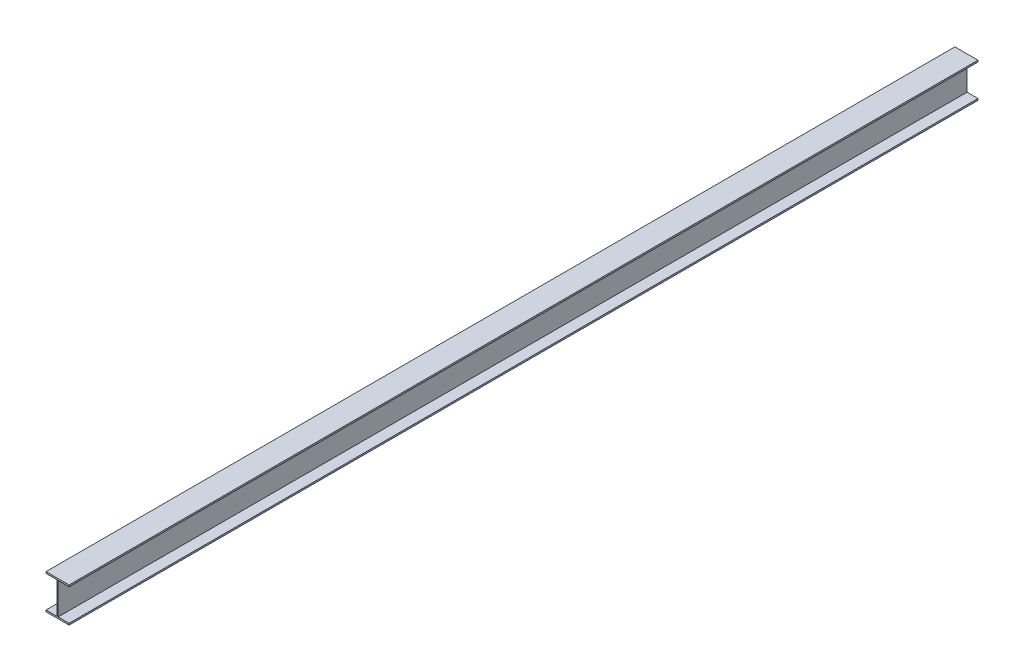
ISO-10303-21;
HEADER;
FILE_DESCRIPTION(('STEP AP214'),'2;1');
FILE_NAME('part.step','',(''),(''),'','','');
FILE_SCHEMA(('AUTOMOTIVE_DESIGN { 1 0 10303 214 1 1 1 1 }'));
ENDSEC;
DATA;
#1=APPLICATION_CONTEXT('core data for automotive mechanical design processes');
#2=APPLICATION_PROTOCOL_DEFINITION('international standard','automotive_design',2000,#1);
#3=PRODUCT_CONTEXT('',#1,'mechanical');
#4=PRODUCT('Part','Part','',(#3));
#5=PRODUCT_RELATED_PRODUCT_CATEGORY('part','',(#4));
#6=PRODUCT_DEFINITION_FORMATION('','',#4);
#7=PRODUCT_DEFINITION_CONTEXT('part definition',#1,'design');
#8=PRODUCT_DEFINITION('design','',#6,#7);
#9=PRODUCT_DEFINITION_SHAPE('','',#8);
#10=(LENGTH_UNIT() NAMED_UNIT(*) SI_UNIT(.MILLI.,.METRE.));
#11=(NAMED_UNIT(*) PLANE_ANGLE_UNIT() SI_UNIT($,.RADIAN.));
#12=(NAMED_UNIT(*) SI_UNIT($,.STERADIAN.) SOLID_ANGLE_UNIT());
#13=UNCERTAINTY_MEASURE_WITH_UNIT(LENGTH_MEASURE(1.E-05),#10,'distance_accuracy_value','');
#14=(GEOMETRIC_REPRESENTATION_CONTEXT(3) GLOBAL_UNCERTAINTY_ASSIGNED_CONTEXT((#13)) GLOBAL_UNIT_ASSIGNED_CONTEXT((#10,
#11,#12)) REPRESENTATION_CONTEXT('',''));
#15=CARTESIAN_POINT('',(0.,0.,0.));
#16=DIRECTION('',(0.,0.,1.));
#17=DIRECTION('',(1.,0.,0.));
#18=AXIS2_PLACEMENT_3D('',#15,#16,#17);
#19=CARTESIAN_POINT('',(101.6,-153.162240532958,4000.));
#20=DIRECTION('',(0.,1.,0.));
#21=DIRECTION('',(0.,0.,1.));
#22=AXIS2_PLACEMENT_3D('',#19,#20,#21);
#23=PLANE('',#22);
#24=DIRECTION('',(-1.,0.,0.));
#25=VECTOR('',#24,1.);
#26=CARTESIAN_POINT('',(101.6,-153.162240532958,2152.4));
#27=LINE('',#26,#25);
#28=CARTESIAN_POINT('',(101.6,-153.162240532958,2152.4));
#29=VERTEX_POINT('',#28);
#30=CARTESIAN_POINT('',(0.,-153.162240532958,2152.4));
#31=VERTEX_POINT('',#30);
#32=EDGE_CURVE('E11',#29,#31,#27,.T.);
#33=ORIENTED_EDGE('',*,*,#32,.F.);
#34=DIRECTION('',(0.,0.,-1.));
#35=VECTOR('',#34,1.);
#36=CARTESIAN_POINT('',(101.6,-153.162240532958,4000.));
#37=LINE('',#36,#35);
#38=CARTESIAN_POINT('',(101.6,-153.162240532958,4000.));
#39=VERTEX_POINT('',#38);
#40=EDGE_CURVE('E177',#39,#29,#37,.T.);
#41=ORIENTED_EDGE('',*,*,#40,.F.);
#42=DIRECTION('',(1.,0.,0.));
#43=VECTOR('',#42,1.);
#44=CARTESIAN_POINT('',(101.6,-153.162240532958,4000.));
#45=LINE('',#44,#43);
#46=CARTESIAN_POINT('',(0.,-153.162240532958,4000.));
#47=VERTEX_POINT('',#46);
#48=EDGE_CURVE('E234',#47,#39,#45,.T.);
#49=ORIENTED_EDGE('',*,*,#48,.F.);
#50=DIRECTION('',(0.,0.,-1.));
#51=VECTOR('',#50,1.);
#52=CARTESIAN_POINT('',(0.,-153.162240532958,4000.));
#53=LINE('',#52,#51);
#54=EDGE_CURVE('E172',#47,#31,#53,.T.);
#55=ORIENTED_EDGE('',*,*,#54,.T.);
#56=EDGE_LOOP('',(#33,#41,#49,#55));
#57=FACE_BOUND('',#56,.T.);
#58=ADVANCED_FACE('F35',(#57),#23,.F.);
#59=DIRECTION('',(1.,0.,0.));
#60=VECTOR('',#59,1.);
#61=CARTESIAN_POINT('',(101.6,-153.162240532958,1847.6));
#62=LINE('',#61,#60);
#63=CARTESIAN_POINT('',(0.,-153.162240532958,1847.6));
#64=VERTEX_POINT('',#63);
#65=CARTESIAN_POINT('',(101.6,-153.162240532958,1847.6));
#66=VERTEX_POINT('',#65);
#67=EDGE_CURVE('E44',#64,#66,#62,.T.);
#68=ORIENTED_EDGE('',*,*,#67,.F.);
#69=CARTESIAN_POINT('',(0.,-153.162240532958,0.));
#70=VERTEX_POINT('',#69);
#71=EDGE_CURVE('E176',#64,#70,#53,.T.);
#72=ORIENTED_EDGE('',*,*,#71,.T.);
#73=DIRECTION('',(1.,0.,0.));
#74=VECTOR('',#73,1.);
#75=CARTESIAN_POINT('',(101.6,-153.162240532958,0.));
#76=LINE('',#75,#74);
#77=CARTESIAN_POINT('',(101.6,-153.162240532958,0.));
#78=VERTEX_POINT('',#77);
#79=EDGE_CURVE('E210',#70,#78,#76,.T.);
#80=ORIENTED_EDGE('',*,*,#79,.T.);
#81=EDGE_CURVE('E181',#66,#78,#37,.T.);
#82=ORIENTED_EDGE('',*,*,#81,.F.);
#83=EDGE_LOOP('',(#68,#72,#80,#82));
#84=FACE_BOUND('',#83,.T.);
#85=ADVANCED_FACE('F292',(#84),#23,.F.);
#86=CARTESIAN_POINT('',(0.,-7.11224053295814,4000.));
#87=DIRECTION('',(1.,0.,0.));
#88=DIRECTION('',(0.,0.,-1.));
#89=AXIS2_PLACEMENT_3D('',#86,#87,#88);
#90=PLANE('',#89);
#91=DIRECTION('',(0.,-1.,0.));
#92=VECTOR('',#91,1.);
#93=CARTESIAN_POINT('',(0.,-7.11224053295814,0.));
#94=LINE('',#93,#92);
#95=CARTESIAN_POINT('',(0.,-0.000240532958142959,0.));
#96=VERTEX_POINT('',#95);
#97=CARTESIAN_POINT('',(0.,-7.11224053295814,0.));
#98=VERTEX_POINT('',#97);
#99=EDGE_CURVE('E161',#96,#98,#94,.T.);
#100=ORIENTED_EDGE('',*,*,#99,.T.);
#101=DIRECTION('',(0.,0.,-1.));
#102=VECTOR('',#101,1.);
#103=CARTESIAN_POINT('',(0.,-7.11224053295814,4000.));
#104=LINE('',#103,#102);
#105=CARTESIAN_POINT('',(0.,-7.11224053295814,4000.));
#106=VERTEX_POINT('',#105);
#107=EDGE_CURVE('E142',#106,#98,#104,.T.);
#108=ORIENTED_EDGE('',*,*,#107,.F.);
#109=DIRECTION('',(0.,-1.,0.));
#110=VECTOR('',#109,1.);
#111=CARTESIAN_POINT('',(0.,-7.11224053295814,4000.));
#112=LINE('',#111,#110);
#113=CARTESIAN_POINT('',(0.,-0.000240532958142959,4000.));
#114=VERTEX_POINT('',#113);
#115=EDGE_CURVE('E149',#114,#106,#112,.T.);
#116=ORIENTED_EDGE('',*,*,#115,.F.);
#117=DIRECTION('',(0.,0.,-1.));
#118=VECTOR('',#117,1.);
#119=CARTESIAN_POINT('',(0.,-0.000240532958142959,4000.));
#120=LINE('',#119,#118);
#121=EDGE_CURVE('E197',#114,#96,#120,.T.);
#122=ORIENTED_EDGE('',*,*,#121,.T.);
#123=EDGE_LOOP('',(#100,#108,#116,#122));
#124=FACE_BOUND('',#123,.T.);
#125=ADVANCED_FACE('F37',(#124),#90,.F.);
#126=CARTESIAN_POINT('',(47.5660357142857,-7.11224053295814,4000.));
#127=DIRECTION('',(0.,1.,0.));
#128=DIRECTION('',(-1.,0.,0.));
#129=AXIS2_PLACEMENT_3D('',#126,#127,#128);
#130=PLANE('',#129);
#131=DIRECTION('',(1.,0.,0.));
#132=VECTOR('',#131,1.);
#133=CARTESIAN_POINT('',(47.5660357142857,-7.11224053295814,0.));
#134=LINE('',#133,#132);
#135=CARTESIAN_POINT('',(47.5660357142857,-7.11224053295814,0.));
#136=VERTEX_POINT('',#135);
#137=EDGE_CURVE('E220',#98,#136,#134,.T.);
#138=ORIENTED_EDGE('',*,*,#137,.T.);
#139=DIRECTION('',(0.,0.,-1.));
#140=VECTOR('',#139,1.);
#141=CARTESIAN_POINT('',(47.5660357142857,-7.11224053295814,4000.));
#142=LINE('',#141,#140);
#143=CARTESIAN_POINT('',(47.5660357142857,-7.11224053295814,4000.));
#144=VERTEX_POINT('',#143);
#145=EDGE_CURVE('E145',#144,#136,#142,.T.);
#146=ORIENTED_EDGE('',*,*,#145,.F.);
#147=DIRECTION('',(1.,0.,0.));
#148=VECTOR('',#147,1.);
#149=CARTESIAN_POINT('',(47.5660357142857,-7.11224053295814,4000.));
#150=LINE('',#149,#148);
#151=EDGE_CURVE('E138',#106,#144,#150,.T.);
#152=ORIENTED_EDGE('',*,*,#151,.F.);
#153=ORIENTED_EDGE('',*,*,#107,.T.);
#154=EDGE_LOOP('',(#138,#146,#152,#153));
#155=FACE_BOUND('',#154,.T.);
#156=ADVANCED_FACE('F140',(#155),#130,.F.);
#157=CARTESIAN_POINT('',(47.5660357142857,-146.050240532958,4000.));
#158=DIRECTION('',(1.,0.,0.));
#159=DIRECTION('',(0.,0.,-1.));
#160=AXIS2_PLACEMENT_3D('',#157,#158,#159);
#161=PLANE('',#160);
#162=DIRECTION('',(0.,-1.,0.));
#163=VECTOR('',#162,1.);
#164=CARTESIAN_POINT('',(47.5660357142857,-146.050240532958,0.));
#165=LINE('',#164,#163);
#166=CARTESIAN_POINT('',(47.5660357142857,-146.050240532958,0.));
#167=VERTEX_POINT('',#166);
#168=EDGE_CURVE('E218',#136,#167,#165,.T.);
#169=ORIENTED_EDGE('',*,*,#168,.T.);
#170=DIRECTION('',(0.,0.,-1.));
#171=VECTOR('',#170,1.);
#172=CARTESIAN_POINT('',(47.5660357142857,-146.050240532958,4000.));
#173=LINE('',#172,#171);
#174=CARTESIAN_POINT('',(47.5660357142857,-146.050240532958,4000.));
#175=VERTEX_POINT('',#174);
#176=EDGE_CURVE('E164',#175,#167,#173,.T.);
#177=ORIENTED_EDGE('',*,*,#176,.F.);
#178=DIRECTION('',(0.,-1.,0.));
#179=VECTOR('',#178,1.);
#180=CARTESIAN_POINT('',(47.5660357142857,-146.050240532958,4000.));
#181=LINE('',#180,#179);
#182=EDGE_CURVE('E148',#144,#175,#181,.T.);
#183=ORIENTED_EDGE('',*,*,#182,.F.);
#184=ORIENTED_EDGE('',*,*,#145,.T.);
#185=EDGE_LOOP('',(#169,#177,#183,#184));
#186=FACE_BOUND('',#185,.T.);
#187=ADVANCED_FACE('F244',(#186),#161,.F.);
#188=CARTESIAN_POINT('',(0.,-146.050240532958,4000.));
#189=DIRECTION('',(0.,-1.,0.));
#190=DIRECTION('',(1.,0.,0.));
#191=AXIS2_PLACEMENT_3D('',#188,#189,#190);
#192=PLANE('',#191);
#193=DIRECTION('',(-1.,0.,0.));
#194=VECTOR('',#193,1.);
#195=CARTESIAN_POINT('',(0.,-146.050240532958,0.));
#196=LINE('',#195,#194);
#197=CARTESIAN_POINT('',(0.,-146.050240532958,0.));
#198=VERTEX_POINT('',#197);
#199=EDGE_CURVE('E216',#167,#198,#196,.T.);
#200=ORIENTED_EDGE('',*,*,#199,.T.);
#201=DIRECTION('',(0.,0.,-1.));
#202=VECTOR('',#201,1.);
#203=CARTESIAN_POINT('',(0.,-146.050240532958,4000.));
#204=LINE('',#203,#202);
#205=CARTESIAN_POINT('',(0.,-146.050240532958,4000.));
#206=VERTEX_POINT('',#205);
#207=EDGE_CURVE('E169',#206,#198,#204,.T.);
#208=ORIENTED_EDGE('',*,*,#207,.F.);
#209=DIRECTION('',(-1.,0.,0.));
#210=VECTOR('',#209,1.);
#211=CARTESIAN_POINT('',(0.,-146.050240532958,4000.));
#212=LINE('',#211,#210);
#213=EDGE_CURVE('E238',#175,#206,#212,.T.);
#214=ORIENTED_EDGE('',*,*,#213,.F.);
#215=ORIENTED_EDGE('',*,*,#176,.T.);
#216=EDGE_LOOP('',(#200,#208,#214,#215));
#217=FACE_BOUND('',#216,.T.);
#218=ADVANCED_FACE('F248',(#217),#192,.F.);
#219=CARTESIAN_POINT('',(0.,-153.162240532958,4000.));
#220=DIRECTION('',(1.,0.,0.));
#221=DIRECTION('',(0.,0.,-1.));
#222=AXIS2_PLACEMENT_3D('',#219,#220,#221);
#223=PLANE('',#222);
#224=DIRECTION('',(0.,-1.,0.));
#225=VECTOR('',#224,1.);
#226=CARTESIAN_POINT('',(0.,-153.162240532958,0.));
#227=LINE('',#226,#225);
#228=EDGE_CURVE('E213',#198,#70,#227,.T.);
#229=ORIENTED_EDGE('',*,*,#228,.T.);
#230=ORIENTED_EDGE('',*,*,#71,.F.);
#231=EDGE_CURVE('E175',#31,#64,#53,.T.);
#232=ORIENTED_EDGE('',*,*,#231,.F.);
#233=ORIENTED_EDGE('',*,*,#54,.F.);
#234=DIRECTION('',(0.,-1.,0.));
#235=VECTOR('',#234,1.);
#236=CARTESIAN_POINT('',(0.,-153.162240532958,4000.));
#237=LINE('',#236,#235);
#238=EDGE_CURVE('E236',#206,#47,#237,.T.);
#239=ORIENTED_EDGE('',*,*,#238,.F.);
#240=ORIENTED_EDGE('',*,*,#207,.T.);
#241=EDGE_LOOP('',(#229,#230,#232,#233,#239,#240));
#242=FACE_BOUND('',#241,.T.);
#243=ADVANCED_FACE('F253',(#242),#223,.F.);
#244=CARTESIAN_POINT('',(101.6,-153.162240532958,2000.));
#245=VERTEX_POINT('',#244);
#246=EDGE_CURVE('E180',#29,#245,#37,.T.);
#247=ORIENTED_EDGE('',*,*,#246,.F.);
#248=ORIENTED_EDGE('',*,*,#32,.T.);
#249=ORIENTED_EDGE('',*,*,#231,.T.);
#250=ORIENTED_EDGE('',*,*,#67,.T.);
#251=EDGE_CURVE('E291',#245,#66,#37,.T.);
#252=ORIENTED_EDGE('',*,*,#251,.F.);
#253=EDGE_LOOP('',(#247,#248,#249,#250,#252));
#254=FACE_BOUND('',#253,.T.);
#255=ADVANCED_FACE('F289',(#254),#23,.F.);
#256=CARTESIAN_POINT('',(101.6,-146.050240532958,4000.));
#257=DIRECTION('',(-1.,0.,0.));
#258=DIRECTION('',(0.,0.,1.));
#259=AXIS2_PLACEMENT_3D('',#256,#257,#258);
#260=PLANE('',#259);
#261=DIRECTION('',(0.,1.,0.));
#262=VECTOR('',#261,1.);
#263=CARTESIAN_POINT('',(101.6,-146.050240532958,0.));
#264=LINE('',#263,#262);
#265=CARTESIAN_POINT('',(101.6,-146.050240532958,0.));
#266=VERTEX_POINT('',#265);
#267=EDGE_CURVE('E208',#78,#266,#264,.T.);
#268=ORIENTED_EDGE('',*,*,#267,.T.);
#269=DIRECTION('',(0.,0.,-1.));
#270=VECTOR('',#269,1.);
#271=CARTESIAN_POINT('',(101.6,-146.050240532958,4000.));
#272=LINE('',#271,#270);
#273=CARTESIAN_POINT('',(101.6,-146.050240532958,4000.));
#274=VERTEX_POINT('',#273);
#275=EDGE_CURVE('E182',#274,#266,#272,.T.);
#276=ORIENTED_EDGE('',*,*,#275,.F.);
#277=DIRECTION('',(0.,1.,0.));
#278=VECTOR('',#277,1.);
#279=CARTESIAN_POINT('',(101.6,-146.050240532958,4000.));
#280=LINE('',#279,#278);
#281=EDGE_CURVE('E232',#39,#274,#280,.T.);
#282=ORIENTED_EDGE('',*,*,#281,.F.);
#283=ORIENTED_EDGE('',*,*,#40,.T.);
#284=ORIENTED_EDGE('',*,*,#246,.T.);
#285=ORIENTED_EDGE('',*,*,#251,.T.);
#286=ORIENTED_EDGE('',*,*,#81,.T.);
#287=EDGE_LOOP('',(#268,#276,#282,#283,#284,#285,#286));
#288=FACE_BOUND('',#287,.T.);
#289=ADVANCED_FACE('F261',(#288),#260,.F.);
#290=CARTESIAN_POINT('',(53.4080357142857,-146.050240532958,4000.));
#291=DIRECTION('',(0.,-1.,0.));
#292=DIRECTION('',(1.,0.,0.));
#293=AXIS2_PLACEMENT_3D('',#290,#291,#292);
#294=PLANE('',#293);
#295=DIRECTION('',(-1.,0.,0.));
#296=VECTOR('',#295,1.);
#297=CARTESIAN_POINT('',(53.4080357142857,-146.050240532958,0.));
#298=LINE('',#297,#296);
#299=CARTESIAN_POINT('',(53.4080357142857,-146.050240532958,0.));
#300=VERTEX_POINT('',#299);
#301=EDGE_CURVE('E206',#266,#300,#298,.T.);
#302=ORIENTED_EDGE('',*,*,#301,.T.);
#303=DIRECTION('',(0.,0.,-1.));
#304=VECTOR('',#303,1.);
#305=CARTESIAN_POINT('',(53.4080357142857,-146.050240532958,4000.));
#306=LINE('',#305,#304);
#307=CARTESIAN_POINT('',(53.4080357142857,-146.050240532958,4000.));
#308=VERTEX_POINT('',#307);
#309=EDGE_CURVE('E185',#308,#300,#306,.T.);
#310=ORIENTED_EDGE('',*,*,#309,.F.);
#311=DIRECTION('',(-1.,0.,0.));
#312=VECTOR('',#311,1.);
#313=CARTESIAN_POINT('',(53.4080357142857,-146.050240532958,4000.));
#314=LINE('',#313,#312);
#315=EDGE_CURVE('E230',#274,#308,#314,.T.);
#316=ORIENTED_EDGE('',*,*,#315,.F.);
#317=ORIENTED_EDGE('',*,*,#275,.T.);
#318=EDGE_LOOP('',(#302,#310,#316,#317));
#319=FACE_BOUND('',#318,.T.);
#320=ADVANCED_FACE('F267',(#319),#294,.F.);
#321=CARTESIAN_POINT('',(53.4080357142857,-7.11224053295815,4000.));
#322=DIRECTION('',(-1.,0.,0.));
#323=DIRECTION('',(0.,-1.,0.));
#324=AXIS2_PLACEMENT_3D('',#321,#322,#323);
#325=PLANE('',#324);
#326=DIRECTION('',(0.,1.,0.));
#327=VECTOR('',#326,1.);
#328=CARTESIAN_POINT('',(53.4080357142857,-7.11224053295815,0.));
#329=LINE('',#328,#327);
#330=CARTESIAN_POINT('',(53.4080357142857,-7.11224053295815,0.));
#331=VERTEX_POINT('',#330);
#332=EDGE_CURVE('E204',#300,#331,#329,.T.);
#333=ORIENTED_EDGE('',*,*,#332,.T.);
#334=DIRECTION('',(0.,0.,-1.));
#335=VECTOR('',#334,1.);
#336=CARTESIAN_POINT('',(53.4080357142857,-7.11224053295815,4000.));
#337=LINE('',#336,#335);
#338=CARTESIAN_POINT('',(53.4080357142857,-7.11224053295815,4000.));
#339=VERTEX_POINT('',#338);
#340=EDGE_CURVE('E188',#339,#331,#337,.T.);
#341=ORIENTED_EDGE('',*,*,#340,.F.);
#342=DIRECTION('',(0.,1.,0.));
#343=VECTOR('',#342,1.);
#344=CARTESIAN_POINT('',(53.4080357142857,-7.11224053295815,4000.));
#345=LINE('',#344,#343);
#346=EDGE_CURVE('E228',#308,#339,#345,.T.);
#347=ORIENTED_EDGE('',*,*,#346,.F.);
#348=ORIENTED_EDGE('',*,*,#309,.T.);
#349=EDGE_LOOP('',(#333,#341,#347,#348));
#350=FACE_BOUND('',#349,.T.);
#351=ADVANCED_FACE('F273',(#350),#325,.F.);
#352=CARTESIAN_POINT('',(101.6,-7.11224053295814,4000.));
#353=DIRECTION('',(0.,1.,0.));
#354=DIRECTION('',(-1.,0.,0.));
#355=AXIS2_PLACEMENT_3D('',#352,#353,#354);
#356=PLANE('',#355);
#357=DIRECTION('',(1.,0.,0.));
#358=VECTOR('',#357,1.);
#359=CARTESIAN_POINT('',(101.6,-7.11224053295814,0.));
#360=LINE('',#359,#358);
#361=CARTESIAN_POINT('',(101.6,-7.11224053295814,0.));
#362=VERTEX_POINT('',#361);
#363=EDGE_CURVE('E202',#331,#362,#360,.T.);
#364=ORIENTED_EDGE('',*,*,#363,.T.);
#365=DIRECTION('',(0.,0.,-1.));
#366=VECTOR('',#365,1.);
#367=CARTESIAN_POINT('',(101.6,-7.11224053295814,4000.));
#368=LINE('',#367,#366);
#369=CARTESIAN_POINT('',(101.6,-7.11224053295814,4000.));
#370=VERTEX_POINT('',#369);
#371=EDGE_CURVE('E191',#370,#362,#368,.T.);
#372=ORIENTED_EDGE('',*,*,#371,.F.);
#373=DIRECTION('',(1.,0.,0.));
#374=VECTOR('',#373,1.);
#375=CARTESIAN_POINT('',(101.6,-7.11224053295814,4000.));
#376=LINE('',#375,#374);
#377=EDGE_CURVE('E226',#339,#370,#376,.T.);
#378=ORIENTED_EDGE('',*,*,#377,.F.);
#379=ORIENTED_EDGE('',*,*,#340,.T.);
#380=EDGE_LOOP('',(#364,#372,#378,#379));
#381=FACE_BOUND('',#380,.T.);
#382=ADVANCED_FACE('F277',(#381),#356,.F.);
#383=CARTESIAN_POINT('',(101.6,-0.000240532958130516,4000.));
#384=DIRECTION('',(-1.,0.,0.));
#385=DIRECTION('',(0.,0.,1.));
#386=AXIS2_PLACEMENT_3D('',#383,#384,#385);
#387=PLANE('',#386);
#388=DIRECTION('',(0.,1.,0.));
#389=VECTOR('',#388,1.);
#390=CARTESIAN_POINT('',(101.6,-0.000240532958130516,0.));
#391=LINE('',#390,#389);
#392=CARTESIAN_POINT('',(101.6,-0.000240532958130516,0.));
#393=VERTEX_POINT('',#392);
#394=EDGE_CURVE('E200',#362,#393,#391,.T.);
#395=ORIENTED_EDGE('',*,*,#394,.T.);
#396=DIRECTION('',(0.,0.,-1.));
#397=VECTOR('',#396,1.);
#398=CARTESIAN_POINT('',(101.6,-0.000240532958130516,4000.));
#399=LINE('',#398,#397);
#400=CARTESIAN_POINT('',(101.6,-0.000240532958130516,4000.));
#401=VERTEX_POINT('',#400);
#402=EDGE_CURVE('E194',#401,#393,#399,.T.);
#403=ORIENTED_EDGE('',*,*,#402,.F.);
#404=DIRECTION('',(0.,1.,0.));
#405=VECTOR('',#404,1.);
#406=CARTESIAN_POINT('',(101.6,-0.000240532958130516,4000.));
#407=LINE('',#406,#405);
#408=EDGE_CURVE('E224',#370,#401,#407,.T.);
#409=ORIENTED_EDGE('',*,*,#408,.F.);
#410=ORIENTED_EDGE('',*,*,#371,.T.);
#411=EDGE_LOOP('',(#395,#403,#409,#410));
#412=FACE_BOUND('',#411,.T.);
#413=ADVANCED_FACE('F282',(#412),#387,.F.);
#414=CARTESIAN_POINT('',(0.,-0.000240532958142959,4000.));
#415=DIRECTION('',(0.,-1.,0.));
#416=DIRECTION('',(1.,0.,0.));
#417=AXIS2_PLACEMENT_3D('',#414,#415,#416);
#418=PLANE('',#417);
#419=DIRECTION('',(-1.,0.,0.));
#420=VECTOR('',#419,1.);
#421=CARTESIAN_POINT('',(0.,-0.000240532958142959,0.));
#422=LINE('',#421,#420);
#423=EDGE_CURVE('E158',#393,#96,#422,.T.);
#424=ORIENTED_EDGE('',*,*,#423,.T.);
#425=ORIENTED_EDGE('',*,*,#121,.F.);
#426=DIRECTION('',(-1.,0.,0.));
#427=VECTOR('',#426,1.);
#428=CARTESIAN_POINT('',(0.,-0.000240532958142959,4000.));
#429=LINE('',#428,#427);
#430=EDGE_CURVE('E154',#401,#114,#429,.T.);
#431=ORIENTED_EDGE('',*,*,#430,.F.);
#432=ORIENTED_EDGE('',*,*,#402,.T.);
#433=EDGE_LOOP('',(#424,#425,#431,#432));
#434=FACE_BOUND('',#433,.T.);
#435=ADVANCED_FACE('F285',(#434),#418,.F.);
#436=CARTESIAN_POINT('',(0.,0.,4000.));
#437=DIRECTION('',(0.,0.,-1.));
#438=DIRECTION('',(-1.,0.,0.));
#439=AXIS2_PLACEMENT_3D('',#436,#437,#438);
#440=PLANE('',#439);
#441=ORIENTED_EDGE('',*,*,#115,.T.);
#442=ORIENTED_EDGE('',*,*,#151,.T.);
#443=ORIENTED_EDGE('',*,*,#182,.T.);
#444=ORIENTED_EDGE('',*,*,#213,.T.);
#445=ORIENTED_EDGE('',*,*,#238,.T.);
#446=ORIENTED_EDGE('',*,*,#48,.T.);
#447=ORIENTED_EDGE('',*,*,#281,.T.);
#448=ORIENTED_EDGE('',*,*,#315,.T.);
#449=ORIENTED_EDGE('',*,*,#346,.T.);
#450=ORIENTED_EDGE('',*,*,#377,.T.);
#451=ORIENTED_EDGE('',*,*,#408,.T.);
#452=ORIENTED_EDGE('',*,*,#430,.T.);
#453=EDGE_LOOP('',(#441,#442,#443,#444,#445,#446,#447,#448,#449,#450,#451,#452));
#454=FACE_BOUND('',#453,.T.);
#455=ADVANCED_FACE('F152',(#454),#440,.F.);
#456=CARTESIAN_POINT('',(0.,0.,0.));
#457=DIRECTION('',(0.,0.,-1.));
#458=DIRECTION('',(-1.,0.,0.));
#459=AXIS2_PLACEMENT_3D('',#456,#457,#458);
#460=PLANE('',#459);
#461=ORIENTED_EDGE('',*,*,#99,.F.);
#462=ORIENTED_EDGE('',*,*,#423,.F.);
#463=ORIENTED_EDGE('',*,*,#394,.F.);
#464=ORIENTED_EDGE('',*,*,#363,.F.);
#465=ORIENTED_EDGE('',*,*,#332,.F.);
#466=ORIENTED_EDGE('',*,*,#301,.F.);
#467=ORIENTED_EDGE('',*,*,#267,.F.);
#468=ORIENTED_EDGE('',*,*,#79,.F.);
#469=ORIENTED_EDGE('',*,*,#228,.F.);
#470=ORIENTED_EDGE('',*,*,#199,.F.);
#471=ORIENTED_EDGE('',*,*,#168,.F.);
#472=ORIENTED_EDGE('',*,*,#137,.F.);
#473=EDGE_LOOP('',(#461,#462,#463,#464,#465,#466,#467,#468,#469,#470,#471,#472));
#474=FACE_BOUND('',#473,.T.);
#475=ADVANCED_FACE('F287',(#474),#460,.T.);
#476=CLOSED_SHELL('',(#58,#85,#125,#156,#187,#218,#243,#255,#289,#320,#351,#382,#413,#435,#455,#475));
#477=MANIFOLD_SOLID_BREP('B2',#476);
#478=ADVANCED_BREP_SHAPE_REPRESENTATION('',(#18,#477),#14);
#479=SHAPE_DEFINITION_REPRESENTATION(#9,#478);
ENDSEC;
END-ISO-10303-21;
